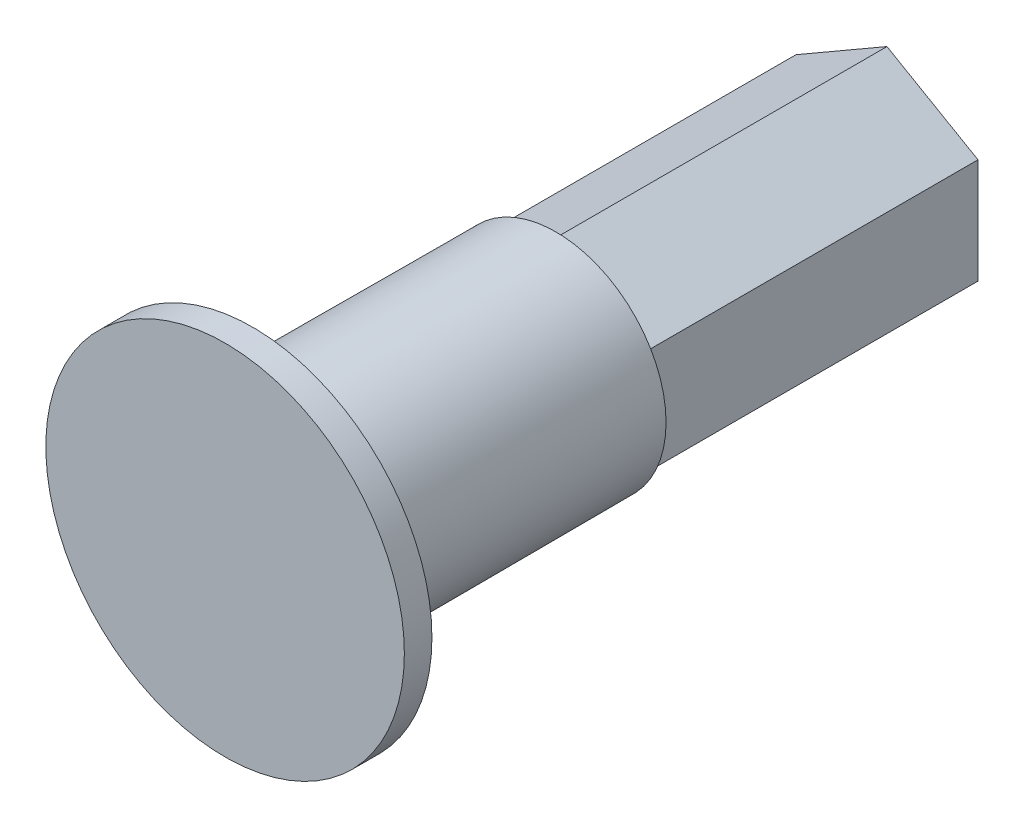
ISO-10303-21;
HEADER;
FILE_DESCRIPTION(('STEP AP214'),'2;1');
FILE_NAME('part.step','',(''),(''),'','','');
FILE_SCHEMA(('AUTOMOTIVE_DESIGN { 1 0 10303 214 1 1 1 1 }'));
ENDSEC;
DATA;
#1=APPLICATION_CONTEXT('core data for automotive mechanical design processes');
#2=APPLICATION_PROTOCOL_DEFINITION('international standard','automotive_design',2000,#1);
#3=PRODUCT_CONTEXT('',#1,'mechanical');
#4=PRODUCT('Part','Part','',(#3));
#5=PRODUCT_RELATED_PRODUCT_CATEGORY('part','',(#4));
#6=PRODUCT_DEFINITION_FORMATION('','',#4);
#7=PRODUCT_DEFINITION_CONTEXT('part definition',#1,'design');
#8=PRODUCT_DEFINITION('design','',#6,#7);
#9=PRODUCT_DEFINITION_SHAPE('','',#8);
#10=(LENGTH_UNIT() NAMED_UNIT(*) SI_UNIT(.MILLI.,.METRE.));
#11=(NAMED_UNIT(*) PLANE_ANGLE_UNIT() SI_UNIT($,.RADIAN.));
#12=(NAMED_UNIT(*) SI_UNIT($,.STERADIAN.) SOLID_ANGLE_UNIT());
#13=UNCERTAINTY_MEASURE_WITH_UNIT(LENGTH_MEASURE(1.E-05),#10,'distance_accuracy_value','');
#14=(GEOMETRIC_REPRESENTATION_CONTEXT(3) GLOBAL_UNCERTAINTY_ASSIGNED_CONTEXT((#13)) GLOBAL_UNIT_ASSIGNED_CONTEXT((#10,
#11,#12)) REPRESENTATION_CONTEXT('',''));
#15=CARTESIAN_POINT('',(0.,0.,0.));
#16=DIRECTION('',(0.,0.,1.));
#17=DIRECTION('',(1.,0.,0.));
#18=AXIS2_PLACEMENT_3D('',#15,#16,#17);
#19=CARTESIAN_POINT('',(0.,0.,-24.));
#20=DIRECTION('',(0.,0.,1.));
#21=DIRECTION('',(1.,0.,0.));
#22=AXIS2_PLACEMENT_3D('',#19,#20,#21);
#23=CONICAL_SURFACE('',#22,3.95,0.00326085800738859);
#24=CARTESIAN_POINT('',(0.,0.,-1.));
#25=DIRECTION('',(0.,0.,1.));
#26=DIRECTION('',(1.,0.,0.));
#27=AXIS2_PLACEMENT_3D('',#24,#25,#26);
#28=CIRCLE('',#27,4.025);
#29=CARTESIAN_POINT('',(4.025,0.,-1.));
#30=VERTEX_POINT('',#29);
#31=EDGE_CURVE('E141',#30,#30,#28,.T.);
#32=ORIENTED_EDGE('',*,*,#31,.F.);
#33=EDGE_LOOP('',(#32));
#34=FACE_BOUND('',#33,.T.);
#35=CARTESIAN_POINT('',(0.,0.,-12.));
#36=DIRECTION('',(0.,0.,-1.));
#37=DIRECTION('',(-1.,0.,0.));
#38=AXIS2_PLACEMENT_3D('',#35,#36,#37);
#39=CIRCLE('',#38,3.98913043478261);
#40=CARTESIAN_POINT('',(-3.98913043478261,0.,-12.));
#41=VERTEX_POINT('',#40);
#42=EDGE_CURVE('E37',#41,#41,#39,.T.);
#43=ORIENTED_EDGE('',*,*,#42,.F.);
#44=EDGE_LOOP('',(#43));
#45=FACE_BOUND('',#44,.T.);
#46=ADVANCED_FACE('F33',(#34,#45),#23,.T.);
#47=CARTESIAN_POINT('',(0.,0.,0.));
#48=DIRECTION('',(0.,0.,-1.));
#49=DIRECTION('',(-1.,0.,0.));
#50=AXIS2_PLACEMENT_3D('',#47,#48,#49);
#51=PLANE('',#50);
#52=CARTESIAN_POINT('',(0.,0.,0.));
#53=DIRECTION('',(0.,0.,1.));
#54=DIRECTION('',(1.,0.,0.));
#55=AXIS2_PLACEMENT_3D('',#52,#53,#54);
#56=CIRCLE('',#55,6.5);
#57=CARTESIAN_POINT('',(6.5,0.,0.));
#58=VERTEX_POINT('',#57);
#59=EDGE_CURVE('E11',#58,#58,#56,.T.);
#60=ORIENTED_EDGE('',*,*,#59,.T.);
#61=EDGE_LOOP('',(#60));
#62=FACE_BOUND('',#61,.T.);
#63=ADVANCED_FACE('F35',(#62),#51,.F.);
#64=CARTESIAN_POINT('',(0.,0.,0.));
#65=DIRECTION('',(0.,0.,1.));
#66=DIRECTION('',(1.,0.,0.));
#67=AXIS2_PLACEMENT_3D('',#64,#65,#66);
#68=CYLINDRICAL_SURFACE('',#67,6.5);
#69=ORIENTED_EDGE('',*,*,#59,.F.);
#70=EDGE_LOOP('',(#69));
#71=FACE_BOUND('',#70,.T.);
#72=CARTESIAN_POINT('',(0.,0.,-1.));
#73=DIRECTION('',(0.,0.,1.));
#74=DIRECTION('',(1.,0.,0.));
#75=AXIS2_PLACEMENT_3D('',#72,#73,#74);
#76=CIRCLE('',#75,6.5);
#77=CARTESIAN_POINT('',(6.5,0.,-1.));
#78=VERTEX_POINT('',#77);
#79=EDGE_CURVE('E42',#78,#78,#76,.T.);
#80=ORIENTED_EDGE('',*,*,#79,.T.);
#81=EDGE_LOOP('',(#80));
#82=FACE_BOUND('',#81,.T.);
#83=ADVANCED_FACE('F147',(#71,#82),#68,.T.);
#84=CARTESIAN_POINT('',(0.,6.5,-1.));
#85=DIRECTION('',(0.,0.,1.));
#86=DIRECTION('',(1.,0.,0.));
#87=AXIS2_PLACEMENT_3D('',#84,#85,#86);
#88=PLANE('',#87);
#89=ORIENTED_EDGE('',*,*,#79,.F.);
#90=EDGE_LOOP('',(#89));
#91=FACE_BOUND('',#90,.T.);
#92=ORIENTED_EDGE('',*,*,#31,.T.);
#93=EDGE_LOOP('',(#92));
#94=FACE_BOUND('',#93,.T.);
#95=ADVANCED_FACE('F149',(#91,#94),#88,.F.);
#96=CARTESIAN_POINT('',(0.,0.,-12.));
#97=DIRECTION('',(0.,0.,-1.));
#98=DIRECTION('',(-1.,0.,0.));
#99=AXIS2_PLACEMENT_3D('',#96,#97,#98);
#100=PLANE('',#99);
#101=DIRECTION('',(0.,1.,0.));
#102=VECTOR('',#101,1.);
#103=CARTESIAN_POINT('',(-3.3,-1.90525588832576,-12.));
#104=LINE('',#103,#102);
#105=CARTESIAN_POINT('',(-3.3,-1.90525588832576,-12.));
#106=VERTEX_POINT('',#105);
#107=CARTESIAN_POINT('',(-3.3,1.90525588832577,-12.));
#108=VERTEX_POINT('',#107);
#109=EDGE_CURVE('E99',#106,#108,#104,.T.);
#110=ORIENTED_EDGE('',*,*,#109,.F.);
#111=DIRECTION('',(-0.866025403784439,0.5,0.));
#112=VECTOR('',#111,1.);
#113=CARTESIAN_POINT('',(0.,-3.81051177665153,-12.));
#114=LINE('',#113,#112);
#115=CARTESIAN_POINT('',(0.,-3.81051177665153,-12.));
#116=VERTEX_POINT('',#115);
#117=EDGE_CURVE('E120',#116,#106,#114,.T.);
#118=ORIENTED_EDGE('',*,*,#117,.F.);
#119=DIRECTION('',(-0.866025403784439,-0.5,0.));
#120=VECTOR('',#119,1.);
#121=CARTESIAN_POINT('',(3.3,-1.90525588832576,-12.));
#122=LINE('',#121,#120);
#123=CARTESIAN_POINT('',(3.3,-1.90525588832576,-12.));
#124=VERTEX_POINT('',#123);
#125=EDGE_CURVE('E117',#124,#116,#122,.T.);
#126=ORIENTED_EDGE('',*,*,#125,.F.);
#127=DIRECTION('',(0.,-1.,0.));
#128=VECTOR('',#127,1.);
#129=CARTESIAN_POINT('',(3.3,1.90525588832577,-12.));
#130=LINE('',#129,#128);
#131=CARTESIAN_POINT('',(3.3,1.90525588832577,-12.));
#132=VERTEX_POINT('',#131);
#133=EDGE_CURVE('E57',#132,#124,#130,.T.);
#134=ORIENTED_EDGE('',*,*,#133,.F.);
#135=DIRECTION('',(0.866025403784439,-0.5,0.));
#136=VECTOR('',#135,1.);
#137=CARTESIAN_POINT('',(0.,3.81051177665153,-12.));
#138=LINE('',#137,#136);
#139=CARTESIAN_POINT('',(0.,3.81051177665153,-12.));
#140=VERTEX_POINT('',#139);
#141=EDGE_CURVE('E91',#140,#132,#138,.T.);
#142=ORIENTED_EDGE('',*,*,#141,.F.);
#143=DIRECTION('',(0.866025403784439,0.5,0.));
#144=VECTOR('',#143,1.);
#145=CARTESIAN_POINT('',(-3.3,1.90525588832577,-12.));
#146=LINE('',#145,#144);
#147=EDGE_CURVE('E105',#108,#140,#146,.T.);
#148=ORIENTED_EDGE('',*,*,#147,.F.);
#149=EDGE_LOOP('',(#110,#118,#126,#134,#142,#148));
#150=FACE_BOUND('',#149,.T.);
#151=ORIENTED_EDGE('',*,*,#42,.T.);
#152=EDGE_LOOP('',(#151));
#153=FACE_BOUND('',#152,.T.);
#154=ADVANCED_FACE('F103',(#150,#153),#100,.T.);
#155=CARTESIAN_POINT('',(-3.3,1.90525588832577,-12.));
#156=DIRECTION('',(-0.5,0.866025403784439,0.));
#157=DIRECTION('',(-0.866025403784439,-0.5,0.));
#158=AXIS2_PLACEMENT_3D('',#155,#156,#157);
#159=PLANE('',#158);
#160=DIRECTION('',(0.866025403784439,0.5,0.));
#161=VECTOR('',#160,1.);
#162=CARTESIAN_POINT('',(-3.3,1.90525588832577,-24.));
#163=LINE('',#162,#161);
#164=CARTESIAN_POINT('',(-3.3,1.90525588832577,-24.));
#165=VERTEX_POINT('',#164);
#166=CARTESIAN_POINT('',(0.,3.81051177665153,-24.));
#167=VERTEX_POINT('',#166);
#168=EDGE_CURVE('E124',#165,#167,#163,.T.);
#169=ORIENTED_EDGE('',*,*,#168,.F.);
#170=DIRECTION('',(0.,0.,-1.));
#171=VECTOR('',#170,1.);
#172=CARTESIAN_POINT('',(-3.3,1.90525588832577,-12.));
#173=LINE('',#172,#171);
#174=EDGE_CURVE('E109',#108,#165,#173,.T.);
#175=ORIENTED_EDGE('',*,*,#174,.F.);
#176=ORIENTED_EDGE('',*,*,#147,.T.);
#177=DIRECTION('',(0.,0.,-1.));
#178=VECTOR('',#177,1.);
#179=CARTESIAN_POINT('',(0.,3.81051177665153,-12.));
#180=LINE('',#179,#178);
#181=EDGE_CURVE('E89',#140,#167,#180,.T.);
#182=ORIENTED_EDGE('',*,*,#181,.T.);
#183=EDGE_LOOP('',(#169,#175,#176,#182));
#184=FACE_BOUND('',#183,.T.);
#185=ADVANCED_FACE('F108',(#184),#159,.T.);
#186=CARTESIAN_POINT('',(-3.3,-1.90525588832576,-12.));
#187=DIRECTION('',(-1.,0.,0.));
#188=DIRECTION('',(0.,-1.,0.));
#189=AXIS2_PLACEMENT_3D('',#186,#187,#188);
#190=PLANE('',#189);
#191=DIRECTION('',(0.,1.,0.));
#192=VECTOR('',#191,1.);
#193=CARTESIAN_POINT('',(-3.3,-1.90525588832576,-24.));
#194=LINE('',#193,#192);
#195=CARTESIAN_POINT('',(-3.3,-1.90525588832576,-24.));
#196=VERTEX_POINT('',#195);
#197=EDGE_CURVE('E110',#196,#165,#194,.T.);
#198=ORIENTED_EDGE('',*,*,#197,.F.);
#199=DIRECTION('',(0.,0.,-1.));
#200=VECTOR('',#199,1.);
#201=CARTESIAN_POINT('',(-3.3,-1.90525588832576,-12.));
#202=LINE('',#201,#200);
#203=EDGE_CURVE('E134',#106,#196,#202,.T.);
#204=ORIENTED_EDGE('',*,*,#203,.F.);
#205=ORIENTED_EDGE('',*,*,#109,.T.);
#206=ORIENTED_EDGE('',*,*,#174,.T.);
#207=EDGE_LOOP('',(#198,#204,#205,#206));
#208=FACE_BOUND('',#207,.T.);
#209=ADVANCED_FACE('F165',(#208),#190,.T.);
#210=CARTESIAN_POINT('',(0.,-3.81051177665153,-12.));
#211=DIRECTION('',(-0.5,-0.866025403784438,0.));
#212=DIRECTION('',(0.866025403784439,-0.5,0.));
#213=AXIS2_PLACEMENT_3D('',#210,#211,#212);
#214=PLANE('',#213);
#215=DIRECTION('',(-0.866025403784439,0.5,0.));
#216=VECTOR('',#215,1.);
#217=CARTESIAN_POINT('',(0.,-3.81051177665153,-24.));
#218=LINE('',#217,#216);
#219=CARTESIAN_POINT('',(0.,-3.81051177665153,-24.));
#220=VERTEX_POINT('',#219);
#221=EDGE_CURVE('E113',#220,#196,#218,.T.);
#222=ORIENTED_EDGE('',*,*,#221,.F.);
#223=DIRECTION('',(0.,0.,-1.));
#224=VECTOR('',#223,1.);
#225=CARTESIAN_POINT('',(0.,-3.81051177665153,-12.));
#226=LINE('',#225,#224);
#227=EDGE_CURVE('E136',#116,#220,#226,.T.);
#228=ORIENTED_EDGE('',*,*,#227,.F.);
#229=ORIENTED_EDGE('',*,*,#117,.T.);
#230=ORIENTED_EDGE('',*,*,#203,.T.);
#231=EDGE_LOOP('',(#222,#228,#229,#230));
#232=FACE_BOUND('',#231,.T.);
#233=ADVANCED_FACE('F208',(#232),#214,.T.);
#234=CARTESIAN_POINT('',(3.3,-1.90525588832576,-12.));
#235=DIRECTION('',(0.5,-0.866025403784439,0.));
#236=DIRECTION('',(0.866025403784439,0.5,0.));
#237=AXIS2_PLACEMENT_3D('',#234,#235,#236);
#238=PLANE('',#237);
#239=DIRECTION('',(-0.866025403784439,-0.5,0.));
#240=VECTOR('',#239,1.);
#241=CARTESIAN_POINT('',(3.3,-1.90525588832576,-24.));
#242=LINE('',#241,#240);
#243=CARTESIAN_POINT('',(3.3,-1.90525588832576,-24.));
#244=VERTEX_POINT('',#243);
#245=EDGE_CURVE('E128',#244,#220,#242,.T.);
#246=ORIENTED_EDGE('',*,*,#245,.F.);
#247=DIRECTION('',(0.,0.,-1.));
#248=VECTOR('',#247,1.);
#249=CARTESIAN_POINT('',(3.3,-1.90525588832576,-12.));
#250=LINE('',#249,#248);
#251=EDGE_CURVE('E138',#124,#244,#250,.T.);
#252=ORIENTED_EDGE('',*,*,#251,.F.);
#253=ORIENTED_EDGE('',*,*,#125,.T.);
#254=ORIENTED_EDGE('',*,*,#227,.T.);
#255=EDGE_LOOP('',(#246,#252,#253,#254));
#256=FACE_BOUND('',#255,.T.);
#257=ADVANCED_FACE('F218',(#256),#238,.T.);
#258=CARTESIAN_POINT('',(3.3,1.90525588832577,-12.));
#259=DIRECTION('',(1.,0.,0.));
#260=DIRECTION('',(0.,1.,0.));
#261=AXIS2_PLACEMENT_3D('',#258,#259,#260);
#262=PLANE('',#261);
#263=DIRECTION('',(0.,-1.,0.));
#264=VECTOR('',#263,1.);
#265=CARTESIAN_POINT('',(3.3,1.90525588832577,-24.));
#266=LINE('',#265,#264);
#267=CARTESIAN_POINT('',(3.3,1.90525588832577,-24.));
#268=VERTEX_POINT('',#267);
#269=EDGE_CURVE('E49',#268,#244,#266,.T.);
#270=ORIENTED_EDGE('',*,*,#269,.F.);
#271=DIRECTION('',(0.,0.,-1.));
#272=VECTOR('',#271,1.);
#273=CARTESIAN_POINT('',(3.3,1.90525588832577,-12.));
#274=LINE('',#273,#272);
#275=EDGE_CURVE('E98',#132,#268,#274,.T.);
#276=ORIENTED_EDGE('',*,*,#275,.F.);
#277=ORIENTED_EDGE('',*,*,#133,.T.);
#278=ORIENTED_EDGE('',*,*,#251,.T.);
#279=EDGE_LOOP('',(#270,#276,#277,#278));
#280=FACE_BOUND('',#279,.T.);
#281=ADVANCED_FACE('F228',(#280),#262,.T.);
#282=CARTESIAN_POINT('',(0.,3.81051177665153,-12.));
#283=DIRECTION('',(0.5,0.866025403784439,0.));
#284=DIRECTION('',(-0.866025403784439,0.5,0.));
#285=AXIS2_PLACEMENT_3D('',#282,#283,#284);
#286=PLANE('',#285);
#287=DIRECTION('',(0.866025403784439,-0.5,0.));
#288=VECTOR('',#287,1.);
#289=CARTESIAN_POINT('',(0.,3.81051177665153,-24.));
#290=LINE('',#289,#288);
#291=EDGE_CURVE('E93',#167,#268,#290,.T.);
#292=ORIENTED_EDGE('',*,*,#291,.F.);
#293=ORIENTED_EDGE('',*,*,#181,.F.);
#294=ORIENTED_EDGE('',*,*,#141,.T.);
#295=ORIENTED_EDGE('',*,*,#275,.T.);
#296=EDGE_LOOP('',(#292,#293,#294,#295));
#297=FACE_BOUND('',#296,.T.);
#298=ADVANCED_FACE('F90',(#297),#286,.T.);
#299=CARTESIAN_POINT('',(0.,3.95,-24.));
#300=DIRECTION('',(0.,0.,1.));
#301=DIRECTION('',(1.,0.,0.));
#302=AXIS2_PLACEMENT_3D('',#299,#300,#301);
#303=PLANE('',#302);
#304=ORIENTED_EDGE('',*,*,#168,.T.);
#305=ORIENTED_EDGE('',*,*,#291,.T.);
#306=ORIENTED_EDGE('',*,*,#269,.T.);
#307=ORIENTED_EDGE('',*,*,#245,.T.);
#308=ORIENTED_EDGE('',*,*,#221,.T.);
#309=ORIENTED_EDGE('',*,*,#197,.T.);
#310=EDGE_LOOP('',(#304,#305,#306,#307,#308,#309));
#311=FACE_BOUND('',#310,.T.);
#312=ADVANCED_FACE('F169',(#311),#303,.F.);
#313=CLOSED_SHELL('',(#46,#63,#83,#95,#154,#185,#209,#233,#257,#281,#298,#312));
#314=MANIFOLD_SOLID_BREP('B2',#313);
#315=ADVANCED_BREP_SHAPE_REPRESENTATION('',(#18,#314),#14);
#316=SHAPE_DEFINITION_REPRESENTATION(#9,#315);
ENDSEC;
END-ISO-10303-21;
